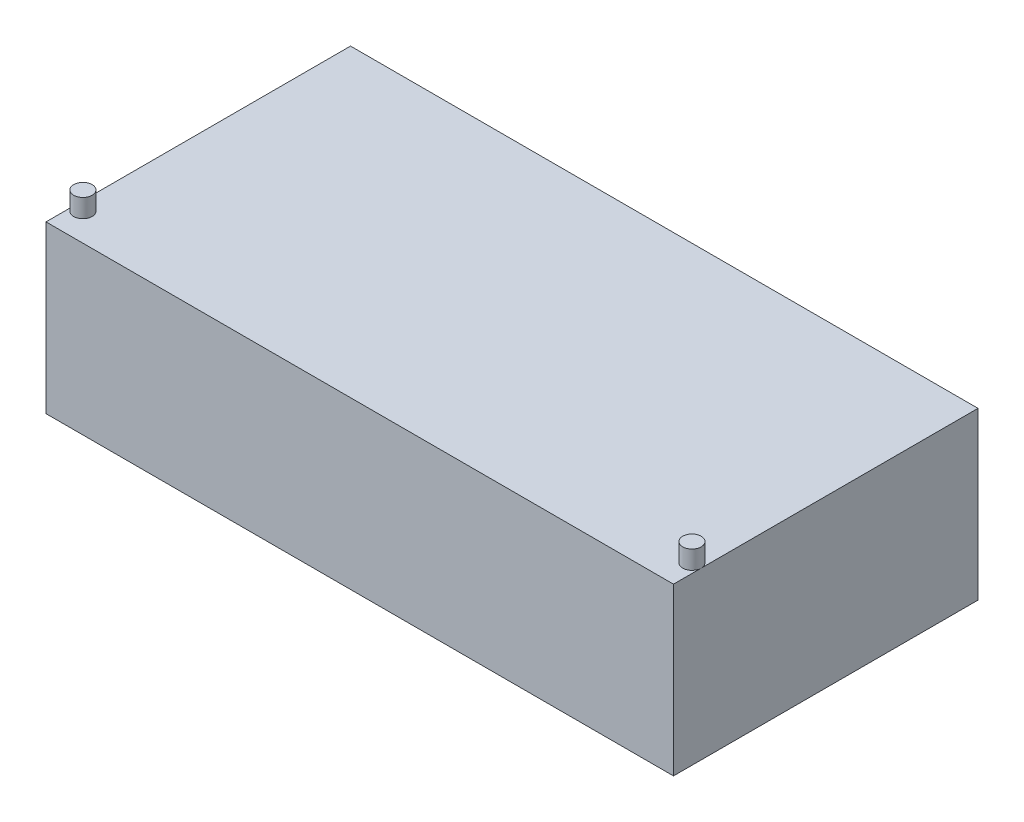
ISO-10303-21;
HEADER;
FILE_DESCRIPTION(('STEP AP214'),'2;1');
FILE_NAME('part.step','',(''),(''),'','','');
FILE_SCHEMA(('AUTOMOTIVE_DESIGN { 1 0 10303 214 1 1 1 1 }'));
ENDSEC;
DATA;
#1=APPLICATION_CONTEXT('core data for automotive mechanical design processes');
#2=APPLICATION_PROTOCOL_DEFINITION('international standard','automotive_design',2000,#1);
#3=PRODUCT_CONTEXT('',#1,'mechanical');
#4=PRODUCT('Part','Part','',(#3));
#5=PRODUCT_RELATED_PRODUCT_CATEGORY('part','',(#4));
#6=PRODUCT_DEFINITION_FORMATION('','',#4);
#7=PRODUCT_DEFINITION_CONTEXT('part definition',#1,'design');
#8=PRODUCT_DEFINITION('design','',#6,#7);
#9=PRODUCT_DEFINITION_SHAPE('','',#8);
#10=(LENGTH_UNIT() NAMED_UNIT(*) SI_UNIT(.MILLI.,.METRE.));
#11=(NAMED_UNIT(*) PLANE_ANGLE_UNIT() SI_UNIT($,.RADIAN.));
#12=(NAMED_UNIT(*) SI_UNIT($,.STERADIAN.) SOLID_ANGLE_UNIT());
#13=UNCERTAINTY_MEASURE_WITH_UNIT(LENGTH_MEASURE(1.E-05),#10,'distance_accuracy_value','');
#14=(GEOMETRIC_REPRESENTATION_CONTEXT(3) GLOBAL_UNCERTAINTY_ASSIGNED_CONTEXT((#13)) GLOBAL_UNIT_ASSIGNED_CONTEXT((#10,
#11,#12)) REPRESENTATION_CONTEXT('',''));
#15=CARTESIAN_POINT('',(0.,0.,0.));
#16=DIRECTION('',(0.,0.,1.));
#17=DIRECTION('',(1.,0.,0.));
#18=AXIS2_PLACEMENT_3D('',#15,#16,#17);
#19=CARTESIAN_POINT('',(170.,90.,-82.5));
#20=DIRECTION('',(-1.,0.,0.));
#21=DIRECTION('',(0.,0.,1.));
#22=AXIS2_PLACEMENT_3D('',#19,#20,#21);
#23=PLANE('',#22);
#24=DIRECTION('',(0.,0.,-1.));
#25=VECTOR('',#24,1.);
#26=CARTESIAN_POINT('',(170.,0.,-82.5));
#27=LINE('',#26,#25);
#28=CARTESIAN_POINT('',(170.,0.,82.5));
#29=VERTEX_POINT('',#28);
#30=CARTESIAN_POINT('',(170.,0.,-82.5));
#31=VERTEX_POINT('',#30);
#32=EDGE_CURVE('E112',#29,#31,#27,.T.);
#33=ORIENTED_EDGE('',*,*,#32,.T.);
#34=DIRECTION('',(0.,-1.,0.));
#35=VECTOR('',#34,1.);
#36=CARTESIAN_POINT('',(170.,90.,-82.5));
#37=LINE('',#36,#35);
#38=CARTESIAN_POINT('',(170.,90.,-82.5));
#39=VERTEX_POINT('',#38);
#40=EDGE_CURVE('E11',#39,#31,#37,.T.);
#41=ORIENTED_EDGE('',*,*,#40,.F.);
#42=DIRECTION('',(0.,0.,-1.));
#43=VECTOR('',#42,1.);
#44=CARTESIAN_POINT('',(170.,90.,-82.5));
#45=LINE('',#44,#43);
#46=CARTESIAN_POINT('',(170.,90.,67.5));
#47=VERTEX_POINT('',#46);
#48=EDGE_CURVE('E86',#47,#39,#45,.T.);
#49=ORIENTED_EDGE('',*,*,#48,.F.);
#50=CARTESIAN_POINT('',(170.,90.,82.5));
#51=VERTEX_POINT('',#50);
#52=EDGE_CURVE('E106',#51,#47,#45,.T.);
#53=ORIENTED_EDGE('',*,*,#52,.F.);
#54=DIRECTION('',(0.,-1.,0.));
#55=VECTOR('',#54,1.);
#56=CARTESIAN_POINT('',(170.,90.,82.5));
#57=LINE('',#56,#55);
#58=EDGE_CURVE('E111',#51,#29,#57,.T.);
#59=ORIENTED_EDGE('',*,*,#58,.T.);
#60=EDGE_LOOP('',(#33,#41,#49,#53,#59));
#61=FACE_BOUND('',#60,.T.);
#62=ADVANCED_FACE('F39',(#61),#23,.F.);
#63=CARTESIAN_POINT('',(-170.,90.,-82.5));
#64=DIRECTION('',(0.,0.,1.));
#65=DIRECTION('',(1.,0.,0.));
#66=AXIS2_PLACEMENT_3D('',#63,#64,#65);
#67=PLANE('',#66);
#68=DIRECTION('',(-1.,0.,0.));
#69=VECTOR('',#68,1.);
#70=CARTESIAN_POINT('',(-170.,0.,-82.5));
#71=LINE('',#70,#69);
#72=CARTESIAN_POINT('',(-170.,0.,-82.5));
#73=VERTEX_POINT('',#72);
#74=EDGE_CURVE('E115',#31,#73,#71,.T.);
#75=ORIENTED_EDGE('',*,*,#74,.T.);
#76=DIRECTION('',(0.,-1.,0.));
#77=VECTOR('',#76,1.);
#78=CARTESIAN_POINT('',(-170.,90.,-82.5));
#79=LINE('',#78,#77);
#80=CARTESIAN_POINT('',(-170.,90.,-82.5));
#81=VERTEX_POINT('',#80);
#82=EDGE_CURVE('E46',#81,#73,#79,.T.);
#83=ORIENTED_EDGE('',*,*,#82,.F.);
#84=DIRECTION('',(-1.,0.,0.));
#85=VECTOR('',#84,1.);
#86=CARTESIAN_POINT('',(-170.,90.,-82.5));
#87=LINE('',#86,#85);
#88=EDGE_CURVE('E97',#39,#81,#87,.T.);
#89=ORIENTED_EDGE('',*,*,#88,.F.);
#90=ORIENTED_EDGE('',*,*,#40,.T.);
#91=EDGE_LOOP('',(#75,#83,#89,#90));
#92=FACE_BOUND('',#91,.T.);
#93=ADVANCED_FACE('F138',(#92),#67,.F.);
#94=CARTESIAN_POINT('',(-170.,90.,-82.5));
#95=DIRECTION('',(1.,0.,0.));
#96=DIRECTION('',(0.,0.,-1.));
#97=AXIS2_PLACEMENT_3D('',#94,#95,#96);
#98=PLANE('',#97);
#99=DIRECTION('',(0.,0.,1.));
#100=VECTOR('',#99,1.);
#101=CARTESIAN_POINT('',(-170.,0.,-82.5));
#102=LINE('',#101,#100);
#103=CARTESIAN_POINT('',(-170.,0.,82.5));
#104=VERTEX_POINT('',#103);
#105=EDGE_CURVE('E118',#73,#104,#102,.T.);
#106=ORIENTED_EDGE('',*,*,#105,.T.);
#107=DIRECTION('',(0.,-1.,0.));
#108=VECTOR('',#107,1.);
#109=CARTESIAN_POINT('',(-170.,90.,82.5));
#110=LINE('',#109,#108);
#111=CARTESIAN_POINT('',(-170.,90.,82.5));
#112=VERTEX_POINT('',#111);
#113=EDGE_CURVE('E105',#112,#104,#110,.T.);
#114=ORIENTED_EDGE('',*,*,#113,.F.);
#115=DIRECTION('',(0.,0.,1.));
#116=VECTOR('',#115,1.);
#117=CARTESIAN_POINT('',(-170.,90.,-82.5));
#118=LINE('',#117,#116);
#119=CARTESIAN_POINT('',(-170.,90.,67.5));
#120=VERTEX_POINT('',#119);
#121=EDGE_CURVE('E101',#120,#112,#118,.T.);
#122=ORIENTED_EDGE('',*,*,#121,.F.);
#123=EDGE_CURVE('E92',#81,#120,#118,.T.);
#124=ORIENTED_EDGE('',*,*,#123,.F.);
#125=ORIENTED_EDGE('',*,*,#82,.T.);
#126=EDGE_LOOP('',(#106,#114,#122,#124,#125));
#127=FACE_BOUND('',#126,.T.);
#128=ADVANCED_FACE('F104',(#127),#98,.F.);
#129=CARTESIAN_POINT('',(-170.,90.,82.5));
#130=DIRECTION('',(0.,0.,-1.));
#131=DIRECTION('',(-1.,0.,0.));
#132=AXIS2_PLACEMENT_3D('',#129,#130,#131);
#133=PLANE('',#132);
#134=DIRECTION('',(1.,0.,0.));
#135=VECTOR('',#134,1.);
#136=CARTESIAN_POINT('',(-170.,0.,82.5));
#137=LINE('',#136,#135);
#138=EDGE_CURVE('E80',#104,#29,#137,.T.);
#139=ORIENTED_EDGE('',*,*,#138,.T.);
#140=ORIENTED_EDGE('',*,*,#58,.F.);
#141=DIRECTION('',(1.,0.,0.));
#142=VECTOR('',#141,1.);
#143=CARTESIAN_POINT('',(-170.,90.,82.5));
#144=LINE('',#143,#142);
#145=EDGE_CURVE('E59',#112,#51,#144,.T.);
#146=ORIENTED_EDGE('',*,*,#145,.F.);
#147=ORIENTED_EDGE('',*,*,#113,.T.);
#148=EDGE_LOOP('',(#139,#140,#146,#147));
#149=FACE_BOUND('',#148,.T.);
#150=ADVANCED_FACE('F130',(#149),#133,.F.);
#151=CARTESIAN_POINT('',(0.,90.,0.));
#152=DIRECTION('',(0.,1.,0.));
#153=DIRECTION('',(0.,0.,1.));
#154=AXIS2_PLACEMENT_3D('',#151,#152,#153);
#155=PLANE('',#154);
#156=ORIENTED_EDGE('',*,*,#52,.T.);
#157=CARTESIAN_POINT('',(165.,90.,67.5));
#158=DIRECTION('',(0.,1.,0.));
#159=DIRECTION('',(0.,0.,1.));
#160=AXIS2_PLACEMENT_3D('',#157,#158,#159);
#161=CIRCLE('',#160,4.99999999999999);
#162=EDGE_CURVE('E51',#47,#47,#161,.T.);
#163=ORIENTED_EDGE('',*,*,#162,.F.);
#164=ORIENTED_EDGE('',*,*,#48,.T.);
#165=ORIENTED_EDGE('',*,*,#88,.T.);
#166=ORIENTED_EDGE('',*,*,#123,.T.);
#167=CARTESIAN_POINT('',(-165.,90.,67.5));
#168=DIRECTION('',(0.,1.,0.));
#169=DIRECTION('',(0.,0.,1.));
#170=AXIS2_PLACEMENT_3D('',#167,#168,#169);
#171=CIRCLE('',#170,4.99999999999999);
#172=EDGE_CURVE('E96',#120,#120,#171,.T.);
#173=ORIENTED_EDGE('',*,*,#172,.F.);
#174=ORIENTED_EDGE('',*,*,#121,.T.);
#175=ORIENTED_EDGE('',*,*,#145,.T.);
#176=EDGE_LOOP('',(#156,#163,#164,#165,#166,#173,#174,#175));
#177=FACE_BOUND('',#176,.T.);
#178=ADVANCED_FACE('F94',(#177),#155,.T.);
#179=CARTESIAN_POINT('',(0.,0.,0.));
#180=DIRECTION('',(0.,1.,0.));
#181=DIRECTION('',(0.,0.,1.));
#182=AXIS2_PLACEMENT_3D('',#179,#180,#181);
#183=PLANE('',#182);
#184=ORIENTED_EDGE('',*,*,#32,.F.);
#185=ORIENTED_EDGE('',*,*,#138,.F.);
#186=ORIENTED_EDGE('',*,*,#105,.F.);
#187=ORIENTED_EDGE('',*,*,#74,.F.);
#188=EDGE_LOOP('',(#184,#185,#186,#187));
#189=FACE_BOUND('',#188,.T.);
#190=ADVANCED_FACE('F126',(#189),#183,.F.);
#191=CARTESIAN_POINT('',(-165.,100.,67.5));
#192=DIRECTION('',(0.,-1.,0.));
#193=DIRECTION('',(0.,0.,-1.));
#194=AXIS2_PLACEMENT_3D('',#191,#192,#193);
#195=CYLINDRICAL_SURFACE('',#194,4.99999999999999);
#196=CARTESIAN_POINT('',(-165.,100.,67.5));
#197=DIRECTION('',(0.,1.,0.));
#198=DIRECTION('',(0.,0.,1.));
#199=AXIS2_PLACEMENT_3D('',#196,#197,#198);
#200=CIRCLE('',#199,4.99999999999999);
#201=CARTESIAN_POINT('',(-165.,100.,72.5));
#202=VERTEX_POINT('',#201);
#203=EDGE_CURVE('E116',#202,#202,#200,.T.);
#204=ORIENTED_EDGE('',*,*,#203,.F.);
#205=EDGE_LOOP('',(#204));
#206=FACE_BOUND('',#205,.T.);
#207=ORIENTED_EDGE('',*,*,#172,.T.);
#208=EDGE_LOOP('',(#207));
#209=FACE_BOUND('',#208,.T.);
#210=ADVANCED_FACE('F170',(#206,#209),#195,.T.);
#211=CARTESIAN_POINT('',(-165.,100.,67.5));
#212=DIRECTION('',(0.,1.,0.));
#213=DIRECTION('',(0.,0.,1.));
#214=AXIS2_PLACEMENT_3D('',#211,#212,#213);
#215=PLANE('',#214);
#216=ORIENTED_EDGE('',*,*,#203,.T.);
#217=EDGE_LOOP('',(#216));
#218=FACE_BOUND('',#217,.T.);
#219=ADVANCED_FACE('F175',(#218),#215,.T.);
#220=CARTESIAN_POINT('',(165.,100.,67.5));
#221=DIRECTION('',(0.,-1.,0.));
#222=DIRECTION('',(0.,0.,-1.));
#223=AXIS2_PLACEMENT_3D('',#220,#221,#222);
#224=CYLINDRICAL_SURFACE('',#223,4.99999999999999);
#225=CARTESIAN_POINT('',(165.,100.,67.5));
#226=DIRECTION('',(0.,1.,0.));
#227=DIRECTION('',(0.,0.,1.));
#228=AXIS2_PLACEMENT_3D('',#225,#226,#227);
#229=CIRCLE('',#228,4.99999999999999);
#230=CARTESIAN_POINT('',(165.,100.,72.5));
#231=VERTEX_POINT('',#230);
#232=EDGE_CURVE('E240',#231,#231,#229,.T.);
#233=ORIENTED_EDGE('',*,*,#232,.F.);
#234=EDGE_LOOP('',(#233));
#235=FACE_BOUND('',#234,.T.);
#236=ORIENTED_EDGE('',*,*,#162,.T.);
#237=EDGE_LOOP('',(#236));
#238=FACE_BOUND('',#237,.T.);
#239=ADVANCED_FACE('F186',(#235,#238),#224,.T.);
#240=CARTESIAN_POINT('',(165.,100.,67.5));
#241=DIRECTION('',(0.,1.,0.));
#242=DIRECTION('',(0.,0.,1.));
#243=AXIS2_PLACEMENT_3D('',#240,#241,#242);
#244=PLANE('',#243);
#245=ORIENTED_EDGE('',*,*,#232,.T.);
#246=EDGE_LOOP('',(#245));
#247=FACE_BOUND('',#246,.T.);
#248=ADVANCED_FACE('F197',(#247),#244,.T.);
#249=CLOSED_SHELL('',(#62,#93,#128,#150,#178,#190,#210,#219,#239,#248));
#250=MANIFOLD_SOLID_BREP('B2',#249);
#251=ADVANCED_BREP_SHAPE_REPRESENTATION('',(#18,#250),#14);
#252=SHAPE_DEFINITION_REPRESENTATION(#9,#251);
ENDSEC;
END-ISO-10303-21;
